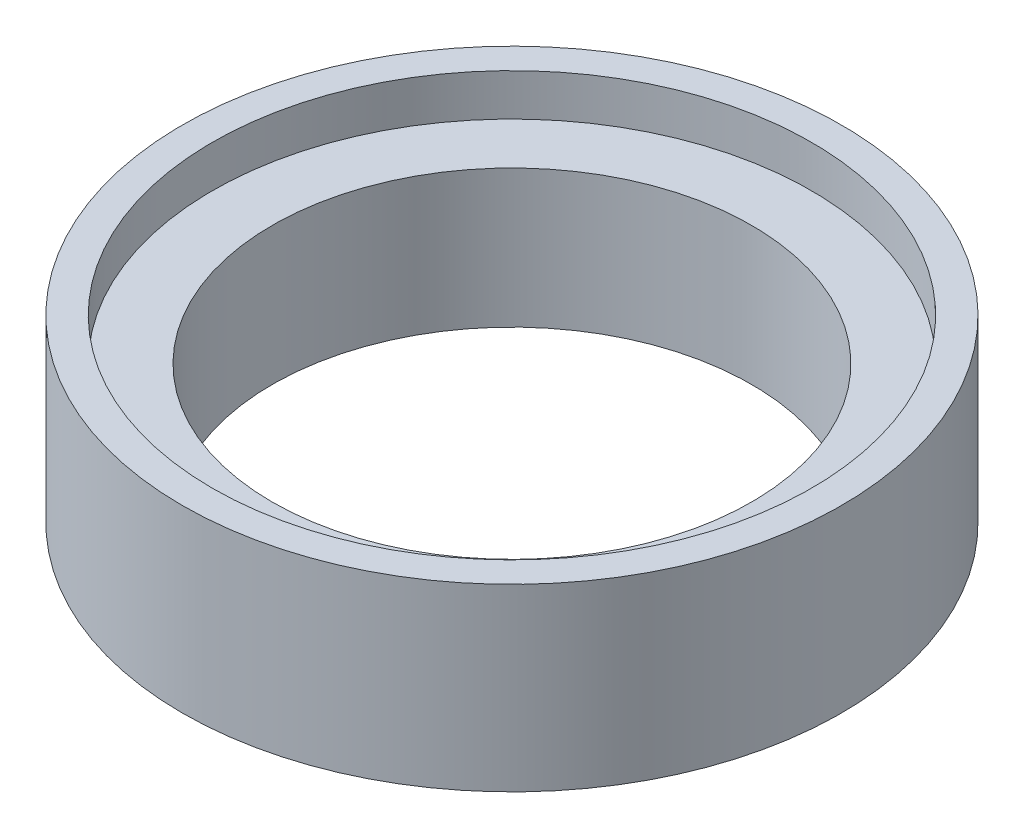
ISO-10303-21;
HEADER;
FILE_DESCRIPTION(('STEP AP214'),'2;1');
FILE_NAME('part.step','',(''),(''),'','','');
FILE_SCHEMA(('AUTOMOTIVE_DESIGN { 1 0 10303 214 1 1 1 1 }'));
ENDSEC;
DATA;
#1=APPLICATION_CONTEXT('core data for automotive mechanical design processes');
#2=APPLICATION_PROTOCOL_DEFINITION('international standard','automotive_design',2000,#1);
#3=PRODUCT_CONTEXT('',#1,'mechanical');
#4=PRODUCT('Part','Part','',(#3));
#5=PRODUCT_RELATED_PRODUCT_CATEGORY('part','',(#4));
#6=PRODUCT_DEFINITION_FORMATION('','',#4);
#7=PRODUCT_DEFINITION_CONTEXT('part definition',#1,'design');
#8=PRODUCT_DEFINITION('design','',#6,#7);
#9=PRODUCT_DEFINITION_SHAPE('','',#8);
#10=(LENGTH_UNIT() NAMED_UNIT(*) SI_UNIT(.MILLI.,.METRE.));
#11=(NAMED_UNIT(*) PLANE_ANGLE_UNIT() SI_UNIT($,.RADIAN.));
#12=(NAMED_UNIT(*) SI_UNIT($,.STERADIAN.) SOLID_ANGLE_UNIT());
#13=UNCERTAINTY_MEASURE_WITH_UNIT(LENGTH_MEASURE(1.E-05),#10,'distance_accuracy_value','');
#14=(GEOMETRIC_REPRESENTATION_CONTEXT(3) GLOBAL_UNCERTAINTY_ASSIGNED_CONTEXT((#13)) GLOBAL_UNIT_ASSIGNED_CONTEXT((#10,
#11,#12)) REPRESENTATION_CONTEXT('',''));
#15=CARTESIAN_POINT('',(0.,0.,0.));
#16=DIRECTION('',(0.,0.,1.));
#17=DIRECTION('',(1.,0.,0.));
#18=AXIS2_PLACEMENT_3D('',#15,#16,#17);
#19=CARTESIAN_POINT('',(0.,3.,0.));
#20=DIRECTION('',(0.,-1.,0.));
#21=DIRECTION('',(0.,0.,-1.));
#22=AXIS2_PLACEMENT_3D('',#19,#20,#21);
#23=CYLINDRICAL_SURFACE('',#22,5.);
#24=CARTESIAN_POINT('',(0.,2.3,0.));
#25=DIRECTION('',(0.,1.,0.));
#26=DIRECTION('',(0.,0.,1.));
#27=AXIS2_PLACEMENT_3D('',#24,#25,#26);
#28=CIRCLE('',#27,5.);
#29=CARTESIAN_POINT('',(0.,2.3,5.));
#30=VERTEX_POINT('',#29);
#31=EDGE_CURVE('E10',#30,#30,#28,.T.);
#32=ORIENTED_EDGE('',*,*,#31,.F.);
#33=EDGE_LOOP('',(#32));
#34=FACE_BOUND('',#33,.T.);
#35=CARTESIAN_POINT('',(0.,3.,0.));
#36=DIRECTION('',(0.,1.,0.));
#37=DIRECTION('',(0.,0.,1.));
#38=AXIS2_PLACEMENT_3D('',#35,#36,#37);
#39=CIRCLE('',#38,5.);
#40=CARTESIAN_POINT('',(0.,3.,5.));
#41=VERTEX_POINT('',#40);
#42=EDGE_CURVE('E51',#41,#41,#39,.T.);
#43=ORIENTED_EDGE('',*,*,#42,.T.);
#44=EDGE_LOOP('',(#43));
#45=FACE_BOUND('',#44,.T.);
#46=ADVANCED_FACE('F41',(#34,#45),#23,.F.);
#47=CARTESIAN_POINT('',(0.,3.,0.));
#48=DIRECTION('',(0.,-1.,0.));
#49=DIRECTION('',(0.,0.,-1.));
#50=AXIS2_PLACEMENT_3D('',#47,#48,#49);
#51=CYLINDRICAL_SURFACE('',#50,5.5);
#52=CARTESIAN_POINT('',(0.,3.,0.));
#53=DIRECTION('',(0.,1.,0.));
#54=DIRECTION('',(0.,0.,1.));
#55=AXIS2_PLACEMENT_3D('',#52,#53,#54);
#56=CIRCLE('',#55,5.5);
#57=CARTESIAN_POINT('',(0.,3.,5.5));
#58=VERTEX_POINT('',#57);
#59=EDGE_CURVE('E47',#58,#58,#56,.T.);
#60=ORIENTED_EDGE('',*,*,#59,.F.);
#61=EDGE_LOOP('',(#60));
#62=FACE_BOUND('',#61,.T.);
#63=CARTESIAN_POINT('',(0.,0.,0.));
#64=DIRECTION('',(0.,1.,0.));
#65=DIRECTION('',(0.,0.,1.));
#66=AXIS2_PLACEMENT_3D('',#63,#64,#65);
#67=CIRCLE('',#66,5.5);
#68=CARTESIAN_POINT('',(0.,0.,5.5));
#69=VERTEX_POINT('',#68);
#70=EDGE_CURVE('E56',#69,#69,#67,.T.);
#71=ORIENTED_EDGE('',*,*,#70,.T.);
#72=EDGE_LOOP('',(#71));
#73=FACE_BOUND('',#72,.T.);
#74=ADVANCED_FACE('F88',(#62,#73),#51,.T.);
#75=CARTESIAN_POINT('',(0.,3.,0.));
#76=DIRECTION('',(0.,1.,0.));
#77=DIRECTION('',(0.,0.,1.));
#78=AXIS2_PLACEMENT_3D('',#75,#76,#77);
#79=PLANE('',#78);
#80=ORIENTED_EDGE('',*,*,#42,.F.);
#81=EDGE_LOOP('',(#80));
#82=FACE_BOUND('',#81,.T.);
#83=ORIENTED_EDGE('',*,*,#59,.T.);
#84=EDGE_LOOP('',(#83));
#85=FACE_BOUND('',#84,.T.);
#86=ADVANCED_FACE('F83',(#82,#85),#79,.T.);
#87=CARTESIAN_POINT('',(0.,0.,0.));
#88=DIRECTION('',(0.,1.,0.));
#89=DIRECTION('',(0.,0.,1.));
#90=AXIS2_PLACEMENT_3D('',#87,#88,#89);
#91=PLANE('',#90);
#92=ORIENTED_EDGE('',*,*,#70,.F.);
#93=EDGE_LOOP('',(#92));
#94=FACE_BOUND('',#93,.T.);
#95=CARTESIAN_POINT('',(0.,0.,0.));
#96=DIRECTION('',(0.,1.,0.));
#97=DIRECTION('',(0.,0.,1.));
#98=AXIS2_PLACEMENT_3D('',#95,#96,#97);
#99=CIRCLE('',#98,4.);
#100=CARTESIAN_POINT('',(0.,0.,4.));
#101=VERTEX_POINT('',#100);
#102=EDGE_CURVE('E64',#101,#101,#99,.T.);
#103=ORIENTED_EDGE('',*,*,#102,.T.);
#104=EDGE_LOOP('',(#103));
#105=FACE_BOUND('',#104,.T.);
#106=ADVANCED_FACE('F71',(#94,#105),#91,.F.);
#107=CARTESIAN_POINT('',(0.,2.3,0.));
#108=DIRECTION('',(0.,-1.,0.));
#109=DIRECTION('',(0.,0.,-1.));
#110=AXIS2_PLACEMENT_3D('',#107,#108,#109);
#111=CYLINDRICAL_SURFACE('',#110,4.);
#112=CARTESIAN_POINT('',(0.,2.3,0.));
#113=DIRECTION('',(0.,1.,0.));
#114=DIRECTION('',(0.,0.,1.));
#115=AXIS2_PLACEMENT_3D('',#112,#113,#114);
#116=CIRCLE('',#115,4.);
#117=CARTESIAN_POINT('',(0.,2.3,4.));
#118=VERTEX_POINT('',#117);
#119=EDGE_CURVE('E60',#118,#118,#116,.T.);
#120=ORIENTED_EDGE('',*,*,#119,.T.);
#121=EDGE_LOOP('',(#120));
#122=FACE_BOUND('',#121,.T.);
#123=ORIENTED_EDGE('',*,*,#102,.F.);
#124=EDGE_LOOP('',(#123));
#125=FACE_BOUND('',#124,.T.);
#126=ADVANCED_FACE('F73',(#122,#125),#111,.F.);
#127=CARTESIAN_POINT('',(0.,2.3,0.));
#128=DIRECTION('',(0.,1.,0.));
#129=DIRECTION('',(0.,0.,1.));
#130=AXIS2_PLACEMENT_3D('',#127,#128,#129);
#131=PLANE('',#130);
#132=ORIENTED_EDGE('',*,*,#119,.F.);
#133=EDGE_LOOP('',(#132));
#134=FACE_BOUND('',#133,.T.);
#135=ORIENTED_EDGE('',*,*,#31,.T.);
#136=EDGE_LOOP('',(#135));
#137=FACE_BOUND('',#136,.T.);
#138=ADVANCED_FACE('F75',(#134,#137),#131,.T.);
#139=CLOSED_SHELL('',(#46,#74,#86,#106,#126,#138));
#140=MANIFOLD_SOLID_BREP('B2',#139);
#141=ADVANCED_BREP_SHAPE_REPRESENTATION('',(#18,#140),#14);
#142=SHAPE_DEFINITION_REPRESENTATION(#9,#141);
ENDSEC;
END-ISO-10303-21;
